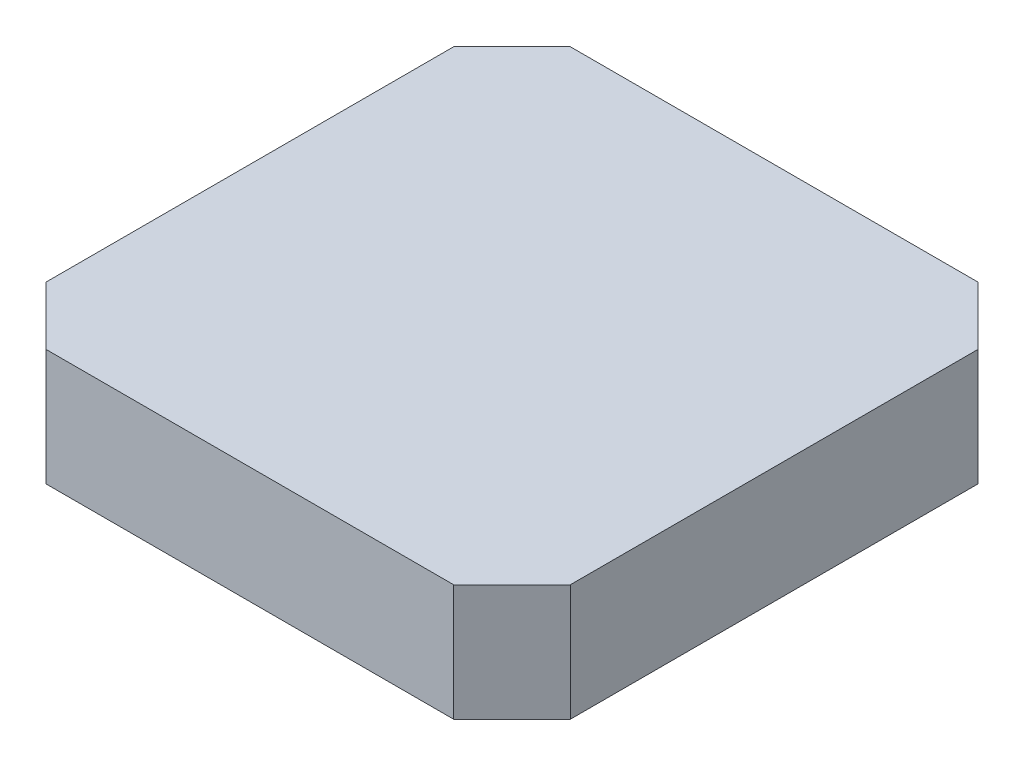
ISO-10303-21;
HEADER;
FILE_DESCRIPTION(('STEP AP214'),'2;1');
FILE_NAME('part.step','',(''),(''),'','','');
FILE_SCHEMA(('AUTOMOTIVE_DESIGN { 1 0 10303 214 1 1 1 1 }'));
ENDSEC;
DATA;
#1=APPLICATION_CONTEXT('core data for automotive mechanical design processes');
#2=APPLICATION_PROTOCOL_DEFINITION('international standard','automotive_design',2000,#1);
#3=PRODUCT_CONTEXT('',#1,'mechanical');
#4=PRODUCT('Part','Part','',(#3));
#5=PRODUCT_RELATED_PRODUCT_CATEGORY('part','',(#4));
#6=PRODUCT_DEFINITION_FORMATION('','',#4);
#7=PRODUCT_DEFINITION_CONTEXT('part definition',#1,'design');
#8=PRODUCT_DEFINITION('design','',#6,#7);
#9=PRODUCT_DEFINITION_SHAPE('','',#8);
#10=(LENGTH_UNIT() NAMED_UNIT(*) SI_UNIT(.MILLI.,.METRE.));
#11=(NAMED_UNIT(*) PLANE_ANGLE_UNIT() SI_UNIT($,.RADIAN.));
#12=(NAMED_UNIT(*) SI_UNIT($,.STERADIAN.) SOLID_ANGLE_UNIT());
#13=UNCERTAINTY_MEASURE_WITH_UNIT(LENGTH_MEASURE(1.E-05),#10,'distance_accuracy_value','');
#14=(GEOMETRIC_REPRESENTATION_CONTEXT(3) GLOBAL_UNCERTAINTY_ASSIGNED_CONTEXT((#13)) GLOBAL_UNIT_ASSIGNED_CONTEXT((#10,
#11,#12)) REPRESENTATION_CONTEXT('',''));
#15=CARTESIAN_POINT('',(0.,0.,0.));
#16=DIRECTION('',(0.,0.,1.));
#17=DIRECTION('',(1.,0.,0.));
#18=AXIS2_PLACEMENT_3D('',#15,#16,#17);
#19=CARTESIAN_POINT('',(57.15,25.4,57.15));
#20=DIRECTION('',(-1.,0.,0.));
#21=DIRECTION('',(0.,0.,1.));
#22=AXIS2_PLACEMENT_3D('',#19,#20,#21);
#23=PLANE('',#22);
#24=DIRECTION('',(0.,0.,-1.));
#25=VECTOR('',#24,1.);
#26=CARTESIAN_POINT('',(57.15,0.,57.15));
#27=LINE('',#26,#25);
#28=CARTESIAN_POINT('',(57.15,0.,44.45));
#29=VERTEX_POINT('',#28);
#30=CARTESIAN_POINT('',(57.15,0.,-44.4499999999999));
#31=VERTEX_POINT('',#30);
#32=EDGE_CURVE('E192',#29,#31,#27,.T.);
#33=ORIENTED_EDGE('',*,*,#32,.T.);
#34=DIRECTION('',(0.,1.,0.));
#35=VECTOR('',#34,1.);
#36=CARTESIAN_POINT('',(57.15,25.4,-44.4499999999999));
#37=LINE('',#36,#35);
#38=CARTESIAN_POINT('',(57.15,25.4,-44.4499999999999));
#39=VERTEX_POINT('',#38);
#40=EDGE_CURVE('E11',#31,#39,#37,.T.);
#41=ORIENTED_EDGE('',*,*,#40,.T.);
#42=DIRECTION('',(0.,0.,-1.));
#43=VECTOR('',#42,1.);
#44=CARTESIAN_POINT('',(57.15,25.4,57.15));
#45=LINE('',#44,#43);
#46=CARTESIAN_POINT('',(57.15,25.4,44.45));
#47=VERTEX_POINT('',#46);
#48=EDGE_CURVE('E145',#47,#39,#45,.T.);
#49=ORIENTED_EDGE('',*,*,#48,.F.);
#50=DIRECTION('',(0.,-1.,0.));
#51=VECTOR('',#50,1.);
#52=CARTESIAN_POINT('',(57.15,25.4,44.45));
#53=LINE('',#52,#51);
#54=EDGE_CURVE('E58',#47,#29,#53,.T.);
#55=ORIENTED_EDGE('',*,*,#54,.T.);
#56=EDGE_LOOP('',(#33,#41,#49,#55));
#57=FACE_BOUND('',#56,.T.);
#58=ADVANCED_FACE('F48',(#57),#23,.F.);
#59=CARTESIAN_POINT('',(-57.15,25.4,-57.15));
#60=DIRECTION('',(0.,0.,1.));
#61=DIRECTION('',(1.,0.,0.));
#62=AXIS2_PLACEMENT_3D('',#59,#60,#61);
#63=PLANE('',#62);
#64=DIRECTION('',(-1.,0.,0.));
#65=VECTOR('',#64,1.);
#66=CARTESIAN_POINT('',(-57.15,0.,-57.15));
#67=LINE('',#66,#65);
#68=CARTESIAN_POINT('',(44.45,0.,-57.15));
#69=VERTEX_POINT('',#68);
#70=CARTESIAN_POINT('',(-44.45,0.,-57.15));
#71=VERTEX_POINT('',#70);
#72=EDGE_CURVE('E152',#69,#71,#67,.T.);
#73=ORIENTED_EDGE('',*,*,#72,.T.);
#74=DIRECTION('',(0.,1.,0.));
#75=VECTOR('',#74,1.);
#76=CARTESIAN_POINT('',(-44.45,25.4,-57.15));
#77=LINE('',#76,#75);
#78=CARTESIAN_POINT('',(-44.45,25.4,-57.15));
#79=VERTEX_POINT('',#78);
#80=EDGE_CURVE('E65',#71,#79,#77,.T.);
#81=ORIENTED_EDGE('',*,*,#80,.T.);
#82=DIRECTION('',(-1.,0.,0.));
#83=VECTOR('',#82,1.);
#84=CARTESIAN_POINT('',(-57.15,25.4,-57.15));
#85=LINE('',#84,#83);
#86=CARTESIAN_POINT('',(44.45,25.4,-57.15));
#87=VERTEX_POINT('',#86);
#88=EDGE_CURVE('E150',#87,#79,#85,.T.);
#89=ORIENTED_EDGE('',*,*,#88,.F.);
#90=DIRECTION('',(0.,-1.,0.));
#91=VECTOR('',#90,1.);
#92=CARTESIAN_POINT('',(44.45,25.4,-57.15));
#93=LINE('',#92,#91);
#94=EDGE_CURVE('E181',#87,#69,#93,.T.);
#95=ORIENTED_EDGE('',*,*,#94,.T.);
#96=EDGE_LOOP('',(#73,#81,#89,#95));
#97=FACE_BOUND('',#96,.T.);
#98=ADVANCED_FACE('F234',(#97),#63,.F.);
#99=CARTESIAN_POINT('',(-57.15,25.4,57.15));
#100=DIRECTION('',(1.,0.,0.));
#101=DIRECTION('',(0.,0.,-1.));
#102=AXIS2_PLACEMENT_3D('',#99,#100,#101);
#103=PLANE('',#102);
#104=DIRECTION('',(0.,0.,1.));
#105=VECTOR('',#104,1.);
#106=CARTESIAN_POINT('',(-57.15,0.,57.15));
#107=LINE('',#106,#105);
#108=CARTESIAN_POINT('',(-57.15,0.,-44.45));
#109=VERTEX_POINT('',#108);
#110=CARTESIAN_POINT('',(-57.15,0.,44.4499999999999));
#111=VERTEX_POINT('',#110);
#112=EDGE_CURVE('E146',#109,#111,#107,.T.);
#113=ORIENTED_EDGE('',*,*,#112,.T.);
#114=DIRECTION('',(0.,1.,0.));
#115=VECTOR('',#114,1.);
#116=CARTESIAN_POINT('',(-57.15,25.4,44.4499999999999));
#117=LINE('',#116,#115);
#118=CARTESIAN_POINT('',(-57.15,25.4,44.4499999999999));
#119=VERTEX_POINT('',#118);
#120=EDGE_CURVE('E121',#111,#119,#117,.T.);
#121=ORIENTED_EDGE('',*,*,#120,.T.);
#122=DIRECTION('',(0.,0.,1.));
#123=VECTOR('',#122,1.);
#124=CARTESIAN_POINT('',(-57.15,25.4,57.15));
#125=LINE('',#124,#123);
#126=CARTESIAN_POINT('',(-57.15,25.4,-44.45));
#127=VERTEX_POINT('',#126);
#128=EDGE_CURVE('E208',#127,#119,#125,.T.);
#129=ORIENTED_EDGE('',*,*,#128,.F.);
#130=DIRECTION('',(0.,-1.,0.));
#131=VECTOR('',#130,1.);
#132=CARTESIAN_POINT('',(-57.15,25.4,-44.45));
#133=LINE('',#132,#131);
#134=EDGE_CURVE('E127',#127,#109,#133,.T.);
#135=ORIENTED_EDGE('',*,*,#134,.T.);
#136=EDGE_LOOP('',(#113,#121,#129,#135));
#137=FACE_BOUND('',#136,.T.);
#138=ADVANCED_FACE('F239',(#137),#103,.F.);
#139=CARTESIAN_POINT('',(-57.15,25.4,57.15));
#140=DIRECTION('',(0.,0.,-1.));
#141=DIRECTION('',(-1.,0.,0.));
#142=AXIS2_PLACEMENT_3D('',#139,#140,#141);
#143=PLANE('',#142);
#144=DIRECTION('',(1.,0.,0.));
#145=VECTOR('',#144,1.);
#146=CARTESIAN_POINT('',(-57.15,25.4,57.15));
#147=LINE('',#146,#145);
#148=CARTESIAN_POINT('',(-44.45,25.4,57.15));
#149=VERTEX_POINT('',#148);
#150=CARTESIAN_POINT('',(44.45,25.4,57.15));
#151=VERTEX_POINT('',#150);
#152=EDGE_CURVE('E137',#149,#151,#147,.T.);
#153=ORIENTED_EDGE('',*,*,#152,.F.);
#154=DIRECTION('',(0.,-1.,0.));
#155=VECTOR('',#154,1.);
#156=CARTESIAN_POINT('',(-44.45,25.4,57.15));
#157=LINE('',#156,#155);
#158=CARTESIAN_POINT('',(-44.45,0.,57.15));
#159=VERTEX_POINT('',#158);
#160=EDGE_CURVE('E120',#149,#159,#157,.T.);
#161=ORIENTED_EDGE('',*,*,#160,.T.);
#162=DIRECTION('',(1.,0.,0.));
#163=VECTOR('',#162,1.);
#164=CARTESIAN_POINT('',(-57.15,0.,57.15));
#165=LINE('',#164,#163);
#166=CARTESIAN_POINT('',(44.45,0.,57.15));
#167=VERTEX_POINT('',#166);
#168=EDGE_CURVE('E134',#159,#167,#165,.T.);
#169=ORIENTED_EDGE('',*,*,#168,.T.);
#170=DIRECTION('',(0.,1.,0.));
#171=VECTOR('',#170,1.);
#172=CARTESIAN_POINT('',(44.45,25.4,57.15));
#173=LINE('',#172,#171);
#174=EDGE_CURVE('E140',#167,#151,#173,.T.);
#175=ORIENTED_EDGE('',*,*,#174,.T.);
#176=EDGE_LOOP('',(#153,#161,#169,#175));
#177=FACE_BOUND('',#176,.T.);
#178=ADVANCED_FACE('F133',(#177),#143,.F.);
#179=CARTESIAN_POINT('',(0.,25.4,0.));
#180=DIRECTION('',(0.,-1.,0.));
#181=DIRECTION('',(0.,0.,-1.));
#182=AXIS2_PLACEMENT_3D('',#179,#180,#181);
#183=PLANE('',#182);
#184=ORIENTED_EDGE('',*,*,#128,.T.);
#185=DIRECTION('',(-0.707106781186547,0.,-0.707106781186548));
#186=VECTOR('',#185,1.);
#187=CARTESIAN_POINT('',(-44.45,25.4,57.15));
#188=LINE('',#187,#186);
#189=EDGE_CURVE('E178',#119,#149,#188,.F.);
#190=ORIENTED_EDGE('',*,*,#189,.T.);
#191=ORIENTED_EDGE('',*,*,#152,.T.);
#192=DIRECTION('',(-0.707106781186548,0.,0.707106781186547));
#193=VECTOR('',#192,1.);
#194=CARTESIAN_POINT('',(57.15,25.4,44.45));
#195=LINE('',#194,#193);
#196=EDGE_CURVE('E170',#151,#47,#195,.F.);
#197=ORIENTED_EDGE('',*,*,#196,.T.);
#198=ORIENTED_EDGE('',*,*,#48,.T.);
#199=DIRECTION('',(0.707106781186547,0.,0.707106781186548));
#200=VECTOR('',#199,1.);
#201=CARTESIAN_POINT('',(44.45,25.4,-57.15));
#202=LINE('',#201,#200);
#203=EDGE_CURVE('E72',#39,#87,#202,.F.);
#204=ORIENTED_EDGE('',*,*,#203,.T.);
#205=ORIENTED_EDGE('',*,*,#88,.T.);
#206=DIRECTION('',(0.707106781186548,0.,-0.707106781186547));
#207=VECTOR('',#206,1.);
#208=CARTESIAN_POINT('',(-57.15,25.4,-44.45));
#209=LINE('',#208,#207);
#210=EDGE_CURVE('E175',#79,#127,#209,.F.);
#211=ORIENTED_EDGE('',*,*,#210,.T.);
#212=EDGE_LOOP('',(#184,#190,#191,#197,#198,#204,#205,#211));
#213=FACE_BOUND('',#212,.T.);
#214=ADVANCED_FACE('F221',(#213),#183,.F.);
#215=CARTESIAN_POINT('',(0.,0.,0.));
#216=DIRECTION('',(0.,-1.,0.));
#217=DIRECTION('',(0.,0.,-1.));
#218=AXIS2_PLACEMENT_3D('',#215,#216,#217);
#219=PLANE('',#218);
#220=CARTESIAN_POINT('',(0.,0.,47.625));
#221=DIRECTION('',(0.,-1.,0.));
#222=DIRECTION('',(0.,0.,-1.));
#223=AXIS2_PLACEMENT_3D('',#220,#221,#222);
#224=CIRCLE('',#223,6.35);
#225=CARTESIAN_POINT('',(0.,0.,41.275));
#226=VERTEX_POINT('',#225);
#227=EDGE_CURVE('E203',#226,#226,#224,.T.);
#228=ORIENTED_EDGE('',*,*,#227,.F.);
#229=EDGE_LOOP('',(#228));
#230=FACE_BOUND('',#229,.T.);
#231=ORIENTED_EDGE('',*,*,#168,.F.);
#232=DIRECTION('',(0.707106781186547,0.,0.707106781186548));
#233=VECTOR('',#232,1.);
#234=CARTESIAN_POINT('',(-50.8,0.,50.7999999999999));
#235=LINE('',#234,#233);
#236=EDGE_CURVE('E116',#159,#111,#235,.F.);
#237=ORIENTED_EDGE('',*,*,#236,.T.);
#238=ORIENTED_EDGE('',*,*,#112,.F.);
#239=DIRECTION('',(-0.707106781186548,0.,0.707106781186547));
#240=VECTOR('',#239,1.);
#241=CARTESIAN_POINT('',(-50.7999999999999,0.,-50.8));
#242=LINE('',#241,#240);
#243=EDGE_CURVE('E128',#109,#71,#242,.F.);
#244=ORIENTED_EDGE('',*,*,#243,.T.);
#245=ORIENTED_EDGE('',*,*,#72,.F.);
#246=DIRECTION('',(-0.707106781186547,0.,-0.707106781186548));
#247=VECTOR('',#246,1.);
#248=CARTESIAN_POINT('',(50.8,0.,-50.7999999999999));
#249=LINE('',#248,#247);
#250=EDGE_CURVE('E160',#69,#31,#249,.F.);
#251=ORIENTED_EDGE('',*,*,#250,.T.);
#252=ORIENTED_EDGE('',*,*,#32,.F.);
#253=DIRECTION('',(0.707106781186548,0.,-0.707106781186547));
#254=VECTOR('',#253,1.);
#255=CARTESIAN_POINT('',(50.7999999999999,0.,50.8));
#256=LINE('',#255,#254);
#257=EDGE_CURVE('E139',#29,#167,#256,.F.);
#258=ORIENTED_EDGE('',*,*,#257,.T.);
#259=EDGE_LOOP('',(#231,#237,#238,#244,#245,#251,#252,#258));
#260=FACE_BOUND('',#259,.T.);
#261=ADVANCED_FACE('F142',(#230,#260),#219,.T.);
#262=CARTESIAN_POINT('',(-44.45,25.4,57.15));
#263=DIRECTION('',(0.707106781186548,0.,-0.707106781186547));
#264=DIRECTION('',(0.,-1.,0.));
#265=AXIS2_PLACEMENT_3D('',#262,#263,#264);
#266=PLANE('',#265);
#267=ORIENTED_EDGE('',*,*,#189,.F.);
#268=ORIENTED_EDGE('',*,*,#120,.F.);
#269=ORIENTED_EDGE('',*,*,#236,.F.);
#270=ORIENTED_EDGE('',*,*,#160,.F.);
#271=EDGE_LOOP('',(#267,#268,#269,#270));
#272=FACE_BOUND('',#271,.T.);
#273=ADVANCED_FACE('F119',(#272),#266,.F.);
#274=CARTESIAN_POINT('',(-57.15,25.4,-44.45));
#275=DIRECTION('',(0.707106781186547,0.,0.707106781186548));
#276=DIRECTION('',(0.,-1.,0.));
#277=AXIS2_PLACEMENT_3D('',#274,#275,#276);
#278=PLANE('',#277);
#279=ORIENTED_EDGE('',*,*,#210,.F.);
#280=ORIENTED_EDGE('',*,*,#80,.F.);
#281=ORIENTED_EDGE('',*,*,#243,.F.);
#282=ORIENTED_EDGE('',*,*,#134,.F.);
#283=EDGE_LOOP('',(#279,#280,#281,#282));
#284=FACE_BOUND('',#283,.T.);
#285=ADVANCED_FACE('F228',(#284),#278,.F.);
#286=CARTESIAN_POINT('',(44.45,25.4,-57.15));
#287=DIRECTION('',(-0.707106781186548,0.,0.707106781186547));
#288=DIRECTION('',(0.,-1.,0.));
#289=AXIS2_PLACEMENT_3D('',#286,#287,#288);
#290=PLANE('',#289);
#291=ORIENTED_EDGE('',*,*,#203,.F.);
#292=ORIENTED_EDGE('',*,*,#40,.F.);
#293=ORIENTED_EDGE('',*,*,#250,.F.);
#294=ORIENTED_EDGE('',*,*,#94,.F.);
#295=EDGE_LOOP('',(#291,#292,#293,#294));
#296=FACE_BOUND('',#295,.T.);
#297=ADVANCED_FACE('F251',(#296),#290,.F.);
#298=CARTESIAN_POINT('',(57.15,25.4,44.45));
#299=DIRECTION('',(-0.707106781186547,0.,-0.707106781186548));
#300=DIRECTION('',(0.,-1.,0.));
#301=AXIS2_PLACEMENT_3D('',#298,#299,#300);
#302=PLANE('',#301);
#303=ORIENTED_EDGE('',*,*,#196,.F.);
#304=ORIENTED_EDGE('',*,*,#174,.F.);
#305=ORIENTED_EDGE('',*,*,#257,.F.);
#306=ORIENTED_EDGE('',*,*,#54,.F.);
#307=EDGE_LOOP('',(#303,#304,#305,#306));
#308=FACE_BOUND('',#307,.T.);
#309=ADVANCED_FACE('F51',(#308),#302,.F.);
#310=CARTESIAN_POINT('',(0.,5.08,47.625));
#311=DIRECTION('',(0.,-1.,0.));
#312=DIRECTION('',(0.,0.,-1.));
#313=AXIS2_PLACEMENT_3D('',#310,#311,#312);
#314=CYLINDRICAL_SURFACE('',#313,6.35);
#315=CARTESIAN_POINT('',(0.,5.08,47.625));
#316=DIRECTION('',(0.,-1.,0.));
#317=DIRECTION('',(0.,0.,-1.));
#318=AXIS2_PLACEMENT_3D('',#315,#316,#317);
#319=CIRCLE('',#318,6.35);
#320=CARTESIAN_POINT('',(0.,5.08,41.275));
#321=VERTEX_POINT('',#320);
#322=EDGE_CURVE('E198',#321,#321,#319,.T.);
#323=ORIENTED_EDGE('',*,*,#322,.F.);
#324=EDGE_LOOP('',(#323));
#325=FACE_BOUND('',#324,.T.);
#326=ORIENTED_EDGE('',*,*,#227,.T.);
#327=EDGE_LOOP('',(#326));
#328=FACE_BOUND('',#327,.T.);
#329=ADVANCED_FACE('F218',(#325,#328),#314,.F.);
#330=CARTESIAN_POINT('',(0.,5.08,0.));
#331=DIRECTION('',(0.,-1.,0.));
#332=DIRECTION('',(0.,0.,-1.));
#333=AXIS2_PLACEMENT_3D('',#330,#331,#332);
#334=PLANE('',#333);
#335=ORIENTED_EDGE('',*,*,#322,.T.);
#336=EDGE_LOOP('',(#335));
#337=FACE_BOUND('',#336,.T.);
#338=ADVANCED_FACE('F304',(#337),#334,.T.);
#339=CLOSED_SHELL('',(#58,#98,#138,#178,#214,#261,#273,#285,#297,#309,#329,#338));
#340=MANIFOLD_SOLID_BREP('B2',#339);
#341=ADVANCED_BREP_SHAPE_REPRESENTATION('',(#18,#340),#14);
#342=SHAPE_DEFINITION_REPRESENTATION(#9,#341);
ENDSEC;
END-ISO-10303-21;
